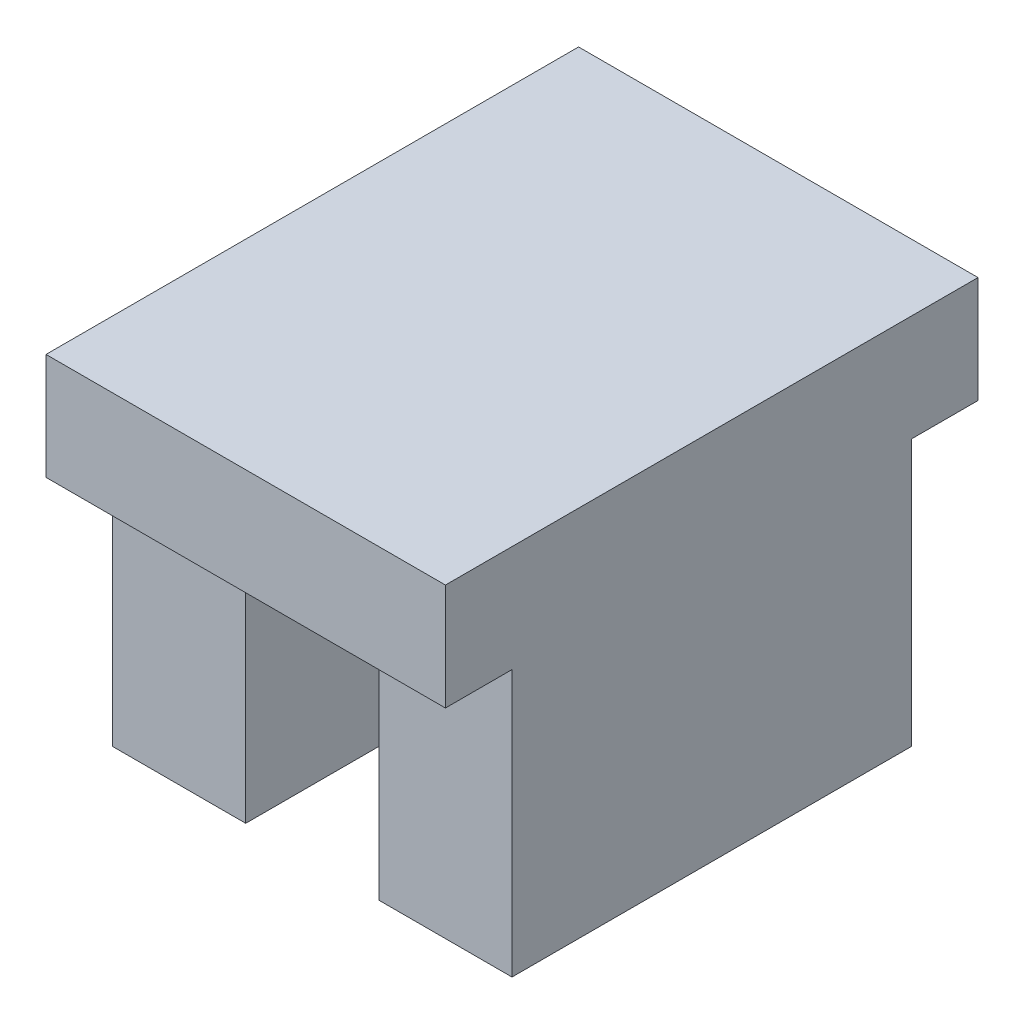
ISO-10303-21;
HEADER;
FILE_DESCRIPTION(('STEP AP214'),'2;1');
FILE_NAME('part.step','',(''),(''),'','','');
FILE_SCHEMA(('AUTOMOTIVE_DESIGN { 1 0 10303 214 1 1 1 1 }'));
ENDSEC;
DATA;
#1=APPLICATION_CONTEXT('core data for automotive mechanical design processes');
#2=APPLICATION_PROTOCOL_DEFINITION('international standard','automotive_design',2000,#1);
#3=PRODUCT_CONTEXT('',#1,'mechanical');
#4=PRODUCT('Part','Part','',(#3));
#5=PRODUCT_RELATED_PRODUCT_CATEGORY('part','',(#4));
#6=PRODUCT_DEFINITION_FORMATION('','',#4);
#7=PRODUCT_DEFINITION_CONTEXT('part definition',#1,'design');
#8=PRODUCT_DEFINITION('design','',#6,#7);
#9=PRODUCT_DEFINITION_SHAPE('','',#8);
#10=(LENGTH_UNIT() NAMED_UNIT(*) SI_UNIT(.MILLI.,.METRE.));
#11=(NAMED_UNIT(*) PLANE_ANGLE_UNIT() SI_UNIT($,.RADIAN.));
#12=(NAMED_UNIT(*) SI_UNIT($,.STERADIAN.) SOLID_ANGLE_UNIT());
#13=UNCERTAINTY_MEASURE_WITH_UNIT(LENGTH_MEASURE(1.E-05),#10,'distance_accuracy_value','');
#14=(GEOMETRIC_REPRESENTATION_CONTEXT(3) GLOBAL_UNCERTAINTY_ASSIGNED_CONTEXT((#13)) GLOBAL_UNIT_ASSIGNED_CONTEXT((#10,
#11,#12)) REPRESENTATION_CONTEXT('',''));
#15=CARTESIAN_POINT('',(0.,0.,0.));
#16=DIRECTION('',(0.,0.,1.));
#17=DIRECTION('',(1.,0.,0.));
#18=AXIS2_PLACEMENT_3D('',#15,#16,#17);
#19=CARTESIAN_POINT('',(0.,0.,-40.));
#20=DIRECTION('',(0.,-1.,0.));
#21=DIRECTION('',(0.,0.,-1.));
#22=AXIS2_PLACEMENT_3D('',#19,#20,#21);
#23=PLANE('',#22);
#24=DIRECTION('',(0.,0.,-1.));
#25=VECTOR('',#24,1.);
#26=CARTESIAN_POINT('',(20.,0.,-5.));
#27=LINE('',#26,#25);
#28=CARTESIAN_POINT('',(20.,0.,-5.));
#29=VERTEX_POINT('',#28);
#30=CARTESIAN_POINT('',(20.,0.,-35.));
#31=VERTEX_POINT('',#30);
#32=EDGE_CURVE('E142',#29,#31,#27,.T.);
#33=ORIENTED_EDGE('',*,*,#32,.F.);
#34=DIRECTION('',(-1.,0.,0.));
#35=VECTOR('',#34,1.);
#36=CARTESIAN_POINT('',(30.,0.,-5.));
#37=LINE('',#36,#35);
#38=CARTESIAN_POINT('',(30.,0.,-5.));
#39=VERTEX_POINT('',#38);
#40=EDGE_CURVE('E128',#39,#29,#37,.T.);
#41=ORIENTED_EDGE('',*,*,#40,.F.);
#42=DIRECTION('',(0.,0.,-1.));
#43=VECTOR('',#42,1.);
#44=CARTESIAN_POINT('',(30.,0.,0.));
#45=LINE('',#44,#43);
#46=CARTESIAN_POINT('',(30.,0.,0.));
#47=VERTEX_POINT('',#46);
#48=EDGE_CURVE('E140',#47,#39,#45,.T.);
#49=ORIENTED_EDGE('',*,*,#48,.F.);
#50=DIRECTION('',(1.,0.,0.));
#51=VECTOR('',#50,1.);
#52=CARTESIAN_POINT('',(0.,0.,0.));
#53=LINE('',#52,#51);
#54=CARTESIAN_POINT('',(0.,0.,0.));
#55=VERTEX_POINT('',#54);
#56=EDGE_CURVE('E153',#55,#47,#53,.T.);
#57=ORIENTED_EDGE('',*,*,#56,.F.);
#58=DIRECTION('',(0.,0.,1.));
#59=VECTOR('',#58,1.);
#60=CARTESIAN_POINT('',(0.,0.,0.));
#61=LINE('',#60,#59);
#62=CARTESIAN_POINT('',(0.,0.,-5.));
#63=VERTEX_POINT('',#62);
#64=EDGE_CURVE('E175',#63,#55,#61,.T.);
#65=ORIENTED_EDGE('',*,*,#64,.F.);
#66=DIRECTION('',(-1.,0.,0.));
#67=VECTOR('',#66,1.);
#68=CARTESIAN_POINT('',(10.,0.,-5.));
#69=LINE('',#68,#67);
#70=CARTESIAN_POINT('',(10.,0.,-5.));
#71=VERTEX_POINT('',#70);
#72=EDGE_CURVE('E200',#71,#63,#69,.T.);
#73=ORIENTED_EDGE('',*,*,#72,.F.);
#74=DIRECTION('',(0.,0.,1.));
#75=VECTOR('',#74,1.);
#76=CARTESIAN_POINT('',(10.,0.,-5.));
#77=LINE('',#76,#75);
#78=CARTESIAN_POINT('',(10.,0.,-35.));
#79=VERTEX_POINT('',#78);
#80=EDGE_CURVE('E58',#79,#71,#77,.T.);
#81=ORIENTED_EDGE('',*,*,#80,.F.);
#82=DIRECTION('',(1.,0.,0.));
#83=VECTOR('',#82,1.);
#84=CARTESIAN_POINT('',(10.,0.,-35.));
#85=LINE('',#84,#83);
#86=CARTESIAN_POINT('',(0.,0.,-35.));
#87=VERTEX_POINT('',#86);
#88=EDGE_CURVE('E197',#87,#79,#85,.T.);
#89=ORIENTED_EDGE('',*,*,#88,.F.);
#90=CARTESIAN_POINT('',(0.,0.,-40.));
#91=VERTEX_POINT('',#90);
#92=EDGE_CURVE('E172',#91,#87,#61,.T.);
#93=ORIENTED_EDGE('',*,*,#92,.F.);
#94=DIRECTION('',(-1.,0.,0.));
#95=VECTOR('',#94,1.);
#96=CARTESIAN_POINT('',(0.,0.,-40.));
#97=LINE('',#96,#95);
#98=CARTESIAN_POINT('',(30.,0.,-40.));
#99=VERTEX_POINT('',#98);
#100=EDGE_CURVE('E148',#99,#91,#97,.T.);
#101=ORIENTED_EDGE('',*,*,#100,.F.);
#102=CARTESIAN_POINT('',(30.,0.,-35.));
#103=VERTEX_POINT('',#102);
#104=EDGE_CURVE('E149',#103,#99,#45,.T.);
#105=ORIENTED_EDGE('',*,*,#104,.F.);
#106=DIRECTION('',(1.,0.,0.));
#107=VECTOR('',#106,1.);
#108=CARTESIAN_POINT('',(30.,0.,-35.));
#109=LINE('',#108,#107);
#110=EDGE_CURVE('E244',#31,#103,#109,.T.);
#111=ORIENTED_EDGE('',*,*,#110,.F.);
#112=EDGE_LOOP('',(#33,#41,#49,#57,#65,#73,#81,#89,#93,#101,#105,#111));
#113=FACE_BOUND('',#112,.T.);
#114=ADVANCED_FACE('F33',(#113),#23,.T.);
#115=CARTESIAN_POINT('',(0.,8.,0.));
#116=DIRECTION('',(1.,0.,0.));
#117=DIRECTION('',(0.,0.,-1.));
#118=AXIS2_PLACEMENT_3D('',#115,#116,#117);
#119=PLANE('',#118);
#120=ORIENTED_EDGE('',*,*,#92,.T.);
#121=DIRECTION('',(0.,1.,0.));
#122=VECTOR('',#121,1.);
#123=CARTESIAN_POINT('',(0.,-20.,-35.));
#124=LINE('',#123,#122);
#125=CARTESIAN_POINT('',(0.,-20.,-35.));
#126=VERTEX_POINT('',#125);
#127=EDGE_CURVE('E187',#126,#87,#124,.T.);
#128=ORIENTED_EDGE('',*,*,#127,.F.);
#129=DIRECTION('',(0.,0.,-1.));
#130=VECTOR('',#129,1.);
#131=CARTESIAN_POINT('',(0.,-20.,-5.));
#132=LINE('',#131,#130);
#133=CARTESIAN_POINT('',(0.,-20.,-5.));
#134=VERTEX_POINT('',#133);
#135=EDGE_CURVE('E190',#134,#126,#132,.T.);
#136=ORIENTED_EDGE('',*,*,#135,.F.);
#137=DIRECTION('',(0.,1.,0.));
#138=VECTOR('',#137,1.);
#139=CARTESIAN_POINT('',(0.,-20.,-5.));
#140=LINE('',#139,#138);
#141=EDGE_CURVE('E183',#134,#63,#140,.T.);
#142=ORIENTED_EDGE('',*,*,#141,.T.);
#143=ORIENTED_EDGE('',*,*,#64,.T.);
#144=DIRECTION('',(0.,-1.,0.));
#145=VECTOR('',#144,1.);
#146=CARTESIAN_POINT('',(0.,8.,0.));
#147=LINE('',#146,#145);
#148=CARTESIAN_POINT('',(0.,8.,0.));
#149=VERTEX_POINT('',#148);
#150=EDGE_CURVE('E11',#149,#55,#147,.T.);
#151=ORIENTED_EDGE('',*,*,#150,.F.);
#152=DIRECTION('',(0.,0.,1.));
#153=VECTOR('',#152,1.);
#154=CARTESIAN_POINT('',(0.,8.,0.));
#155=LINE('',#154,#153);
#156=CARTESIAN_POINT('',(0.,8.,-40.));
#157=VERTEX_POINT('',#156);
#158=EDGE_CURVE('E151',#157,#149,#155,.T.);
#159=ORIENTED_EDGE('',*,*,#158,.F.);
#160=DIRECTION('',(0.,-1.,0.));
#161=VECTOR('',#160,1.);
#162=CARTESIAN_POINT('',(0.,8.,-40.));
#163=LINE('',#162,#161);
#164=EDGE_CURVE('E165',#157,#91,#163,.T.);
#165=ORIENTED_EDGE('',*,*,#164,.T.);
#166=EDGE_LOOP('',(#120,#128,#136,#142,#143,#151,#159,#165));
#167=FACE_BOUND('',#166,.T.);
#168=ADVANCED_FACE('F35',(#167),#119,.F.);
#169=CARTESIAN_POINT('',(0.,8.,0.));
#170=DIRECTION('',(0.,0.,-1.));
#171=DIRECTION('',(-1.,0.,0.));
#172=AXIS2_PLACEMENT_3D('',#169,#170,#171);
#173=PLANE('',#172);
#174=ORIENTED_EDGE('',*,*,#56,.T.);
#175=DIRECTION('',(0.,-1.,0.));
#176=VECTOR('',#175,1.);
#177=CARTESIAN_POINT('',(30.,8.,0.));
#178=LINE('',#177,#176);
#179=CARTESIAN_POINT('',(30.,8.,0.));
#180=VERTEX_POINT('',#179);
#181=EDGE_CURVE('E42',#180,#47,#178,.T.);
#182=ORIENTED_EDGE('',*,*,#181,.F.);
#183=DIRECTION('',(1.,0.,0.));
#184=VECTOR('',#183,1.);
#185=CARTESIAN_POINT('',(0.,8.,0.));
#186=LINE('',#185,#184);
#187=EDGE_CURVE('E159',#149,#180,#186,.T.);
#188=ORIENTED_EDGE('',*,*,#187,.F.);
#189=ORIENTED_EDGE('',*,*,#150,.T.);
#190=EDGE_LOOP('',(#174,#182,#188,#189));
#191=FACE_BOUND('',#190,.T.);
#192=ADVANCED_FACE('F261',(#191),#173,.F.);
#193=CARTESIAN_POINT('',(30.,8.,0.));
#194=DIRECTION('',(-1.,0.,0.));
#195=DIRECTION('',(0.,0.,1.));
#196=AXIS2_PLACEMENT_3D('',#193,#194,#195);
#197=PLANE('',#196);
#198=ORIENTED_EDGE('',*,*,#48,.T.);
#199=DIRECTION('',(0.,1.,0.));
#200=VECTOR('',#199,1.);
#201=CARTESIAN_POINT('',(30.,-20.,-5.));
#202=LINE('',#201,#200);
#203=CARTESIAN_POINT('',(30.,-20.,-5.));
#204=VERTEX_POINT('',#203);
#205=EDGE_CURVE('E124',#204,#39,#202,.T.);
#206=ORIENTED_EDGE('',*,*,#205,.F.);
#207=DIRECTION('',(0.,0.,1.));
#208=VECTOR('',#207,1.);
#209=CARTESIAN_POINT('',(30.,-20.,-5.));
#210=LINE('',#209,#208);
#211=CARTESIAN_POINT('',(30.,-20.,-35.));
#212=VERTEX_POINT('',#211);
#213=EDGE_CURVE('E229',#212,#204,#210,.T.);
#214=ORIENTED_EDGE('',*,*,#213,.F.);
#215=DIRECTION('',(0.,1.,0.));
#216=VECTOR('',#215,1.);
#217=CARTESIAN_POINT('',(30.,-20.,-35.));
#218=LINE('',#217,#216);
#219=EDGE_CURVE('E228',#212,#103,#218,.T.);
#220=ORIENTED_EDGE('',*,*,#219,.T.);
#221=ORIENTED_EDGE('',*,*,#104,.T.);
#222=DIRECTION('',(0.,-1.,0.));
#223=VECTOR('',#222,1.);
#224=CARTESIAN_POINT('',(30.,8.,-40.));
#225=LINE('',#224,#223);
#226=CARTESIAN_POINT('',(30.,8.,-40.));
#227=VERTEX_POINT('',#226);
#228=EDGE_CURVE('E168',#227,#99,#225,.T.);
#229=ORIENTED_EDGE('',*,*,#228,.F.);
#230=DIRECTION('',(0.,0.,-1.));
#231=VECTOR('',#230,1.);
#232=CARTESIAN_POINT('',(30.,8.,0.));
#233=LINE('',#232,#231);
#234=EDGE_CURVE('E161',#180,#227,#233,.T.);
#235=ORIENTED_EDGE('',*,*,#234,.F.);
#236=ORIENTED_EDGE('',*,*,#181,.T.);
#237=EDGE_LOOP('',(#198,#206,#214,#220,#221,#229,#235,#236));
#238=FACE_BOUND('',#237,.T.);
#239=ADVANCED_FACE('F145',(#238),#197,.F.);
#240=CARTESIAN_POINT('',(0.,8.,-40.));
#241=DIRECTION('',(0.,0.,1.));
#242=DIRECTION('',(1.,0.,0.));
#243=AXIS2_PLACEMENT_3D('',#240,#241,#242);
#244=PLANE('',#243);
#245=ORIENTED_EDGE('',*,*,#100,.T.);
#246=ORIENTED_EDGE('',*,*,#164,.F.);
#247=DIRECTION('',(-1.,0.,0.));
#248=VECTOR('',#247,1.);
#249=CARTESIAN_POINT('',(0.,8.,-40.));
#250=LINE('',#249,#248);
#251=EDGE_CURVE('E163',#227,#157,#250,.T.);
#252=ORIENTED_EDGE('',*,*,#251,.F.);
#253=ORIENTED_EDGE('',*,*,#228,.T.);
#254=EDGE_LOOP('',(#245,#246,#252,#253));
#255=FACE_BOUND('',#254,.T.);
#256=ADVANCED_FACE('F223',(#255),#244,.F.);
#257=CARTESIAN_POINT('',(0.,8.,-40.));
#258=DIRECTION('',(0.,-1.,0.));
#259=DIRECTION('',(0.,0.,-1.));
#260=AXIS2_PLACEMENT_3D('',#257,#258,#259);
#261=PLANE('',#260);
#262=ORIENTED_EDGE('',*,*,#158,.T.);
#263=ORIENTED_EDGE('',*,*,#187,.T.);
#264=ORIENTED_EDGE('',*,*,#234,.T.);
#265=ORIENTED_EDGE('',*,*,#251,.T.);
#266=EDGE_LOOP('',(#262,#263,#264,#265));
#267=FACE_BOUND('',#266,.T.);
#268=ADVANCED_FACE('F266',(#267),#261,.F.);
#269=CARTESIAN_POINT('',(10.,-20.,-5.));
#270=DIRECTION('',(-1.,0.,0.));
#271=DIRECTION('',(0.,0.,1.));
#272=AXIS2_PLACEMENT_3D('',#269,#270,#271);
#273=PLANE('',#272);
#274=ORIENTED_EDGE('',*,*,#80,.T.);
#275=DIRECTION('',(0.,1.,0.));
#276=VECTOR('',#275,1.);
#277=CARTESIAN_POINT('',(10.,-20.,-5.));
#278=LINE('',#277,#276);
#279=CARTESIAN_POINT('',(10.,-20.,-5.));
#280=VERTEX_POINT('',#279);
#281=EDGE_CURVE('E179',#280,#71,#278,.T.);
#282=ORIENTED_EDGE('',*,*,#281,.F.);
#283=DIRECTION('',(0.,0.,1.));
#284=VECTOR('',#283,1.);
#285=CARTESIAN_POINT('',(10.,-20.,-5.));
#286=LINE('',#285,#284);
#287=CARTESIAN_POINT('',(10.,-20.,-35.));
#288=VERTEX_POINT('',#287);
#289=EDGE_CURVE('E194',#288,#280,#286,.T.);
#290=ORIENTED_EDGE('',*,*,#289,.F.);
#291=DIRECTION('',(0.,1.,0.));
#292=VECTOR('',#291,1.);
#293=CARTESIAN_POINT('',(10.,-20.,-35.));
#294=LINE('',#293,#292);
#295=EDGE_CURVE('E184',#288,#79,#294,.T.);
#296=ORIENTED_EDGE('',*,*,#295,.T.);
#297=EDGE_LOOP('',(#274,#282,#290,#296));
#298=FACE_BOUND('',#297,.T.);
#299=ADVANCED_FACE('F264',(#298),#273,.F.);
#300=CARTESIAN_POINT('',(10.,-20.,-5.));
#301=DIRECTION('',(0.,0.,-1.));
#302=DIRECTION('',(-1.,0.,0.));
#303=AXIS2_PLACEMENT_3D('',#300,#301,#302);
#304=PLANE('',#303);
#305=ORIENTED_EDGE('',*,*,#72,.T.);
#306=ORIENTED_EDGE('',*,*,#141,.F.);
#307=DIRECTION('',(-1.,0.,0.));
#308=VECTOR('',#307,1.);
#309=CARTESIAN_POINT('',(10.,-20.,-5.));
#310=LINE('',#309,#308);
#311=EDGE_CURVE('E192',#280,#134,#310,.T.);
#312=ORIENTED_EDGE('',*,*,#311,.F.);
#313=ORIENTED_EDGE('',*,*,#281,.T.);
#314=EDGE_LOOP('',(#305,#306,#312,#313));
#315=FACE_BOUND('',#314,.T.);
#316=ADVANCED_FACE('F280',(#315),#304,.F.);
#317=CARTESIAN_POINT('',(10.,-20.,-35.));
#318=DIRECTION('',(0.,0.,1.));
#319=DIRECTION('',(1.,0.,0.));
#320=AXIS2_PLACEMENT_3D('',#317,#318,#319);
#321=PLANE('',#320);
#322=ORIENTED_EDGE('',*,*,#88,.T.);
#323=ORIENTED_EDGE('',*,*,#295,.F.);
#324=DIRECTION('',(1.,0.,0.));
#325=VECTOR('',#324,1.);
#326=CARTESIAN_POINT('',(10.,-20.,-35.));
#327=LINE('',#326,#325);
#328=EDGE_CURVE('E188',#126,#288,#327,.T.);
#329=ORIENTED_EDGE('',*,*,#328,.F.);
#330=ORIENTED_EDGE('',*,*,#127,.T.);
#331=EDGE_LOOP('',(#322,#323,#329,#330));
#332=FACE_BOUND('',#331,.T.);
#333=ADVANCED_FACE('F213',(#332),#321,.F.);
#334=CARTESIAN_POINT('',(10.,-20.,-5.));
#335=DIRECTION('',(0.,1.,0.));
#336=DIRECTION('',(0.,0.,1.));
#337=AXIS2_PLACEMENT_3D('',#334,#335,#336);
#338=PLANE('',#337);
#339=ORIENTED_EDGE('',*,*,#289,.T.);
#340=ORIENTED_EDGE('',*,*,#311,.T.);
#341=ORIENTED_EDGE('',*,*,#135,.T.);
#342=ORIENTED_EDGE('',*,*,#328,.T.);
#343=EDGE_LOOP('',(#339,#340,#341,#342));
#344=FACE_BOUND('',#343,.T.);
#345=ADVANCED_FACE('F285',(#344),#338,.F.);
#346=CARTESIAN_POINT('',(30.,-20.,-5.));
#347=DIRECTION('',(0.,0.,-1.));
#348=DIRECTION('',(-1.,0.,0.));
#349=AXIS2_PLACEMENT_3D('',#346,#347,#348);
#350=PLANE('',#349);
#351=ORIENTED_EDGE('',*,*,#40,.T.);
#352=DIRECTION('',(0.,1.,0.));
#353=VECTOR('',#352,1.);
#354=CARTESIAN_POINT('',(20.,-20.,-5.));
#355=LINE('',#354,#353);
#356=CARTESIAN_POINT('',(20.,-20.,-5.));
#357=VERTEX_POINT('',#356);
#358=EDGE_CURVE('E135',#357,#29,#355,.T.);
#359=ORIENTED_EDGE('',*,*,#358,.F.);
#360=DIRECTION('',(-1.,0.,0.));
#361=VECTOR('',#360,1.);
#362=CARTESIAN_POINT('',(30.,-20.,-5.));
#363=LINE('',#362,#361);
#364=EDGE_CURVE('E130',#204,#357,#363,.T.);
#365=ORIENTED_EDGE('',*,*,#364,.F.);
#366=ORIENTED_EDGE('',*,*,#205,.T.);
#367=EDGE_LOOP('',(#351,#359,#365,#366));
#368=FACE_BOUND('',#367,.T.);
#369=ADVANCED_FACE('F126',(#368),#350,.F.);
#370=CARTESIAN_POINT('',(20.,-20.,-5.));
#371=DIRECTION('',(1.,0.,0.));
#372=DIRECTION('',(0.,0.,-1.));
#373=AXIS2_PLACEMENT_3D('',#370,#371,#372);
#374=PLANE('',#373);
#375=ORIENTED_EDGE('',*,*,#32,.T.);
#376=DIRECTION('',(0.,1.,0.));
#377=VECTOR('',#376,1.);
#378=CARTESIAN_POINT('',(20.,-20.,-35.));
#379=LINE('',#378,#377);
#380=CARTESIAN_POINT('',(20.,-20.,-35.));
#381=VERTEX_POINT('',#380);
#382=EDGE_CURVE('E50',#381,#31,#379,.T.);
#383=ORIENTED_EDGE('',*,*,#382,.F.);
#384=DIRECTION('',(0.,0.,-1.));
#385=VECTOR('',#384,1.);
#386=CARTESIAN_POINT('',(20.,-20.,-5.));
#387=LINE('',#386,#385);
#388=EDGE_CURVE('E233',#357,#381,#387,.T.);
#389=ORIENTED_EDGE('',*,*,#388,.F.);
#390=ORIENTED_EDGE('',*,*,#358,.T.);
#391=EDGE_LOOP('',(#375,#383,#389,#390));
#392=FACE_BOUND('',#391,.T.);
#393=ADVANCED_FACE('F239',(#392),#374,.F.);
#394=CARTESIAN_POINT('',(30.,-20.,-35.));
#395=DIRECTION('',(0.,0.,1.));
#396=DIRECTION('',(1.,0.,0.));
#397=AXIS2_PLACEMENT_3D('',#394,#395,#396);
#398=PLANE('',#397);
#399=ORIENTED_EDGE('',*,*,#110,.T.);
#400=ORIENTED_EDGE('',*,*,#219,.F.);
#401=DIRECTION('',(1.,0.,0.));
#402=VECTOR('',#401,1.);
#403=CARTESIAN_POINT('',(30.,-20.,-35.));
#404=LINE('',#403,#402);
#405=EDGE_CURVE('E230',#381,#212,#404,.T.);
#406=ORIENTED_EDGE('',*,*,#405,.F.);
#407=ORIENTED_EDGE('',*,*,#382,.T.);
#408=EDGE_LOOP('',(#399,#400,#406,#407));
#409=FACE_BOUND('',#408,.T.);
#410=ADVANCED_FACE('F246',(#409),#398,.F.);
#411=CARTESIAN_POINT('',(30.,-20.,-5.));
#412=DIRECTION('',(0.,1.,0.));
#413=DIRECTION('',(0.,0.,1.));
#414=AXIS2_PLACEMENT_3D('',#411,#412,#413);
#415=PLANE('',#414);
#416=ORIENTED_EDGE('',*,*,#213,.T.);
#417=ORIENTED_EDGE('',*,*,#364,.T.);
#418=ORIENTED_EDGE('',*,*,#388,.T.);
#419=ORIENTED_EDGE('',*,*,#405,.T.);
#420=EDGE_LOOP('',(#416,#417,#418,#419));
#421=FACE_BOUND('',#420,.T.);
#422=ADVANCED_FACE('F248',(#421),#415,.F.);
#423=CLOSED_SHELL('',(#114,#168,#192,#239,#256,#268,#299,#316,#333,#345,#369,#393,#410,#422));
#424=MANIFOLD_SOLID_BREP('B2',#423);
#425=ADVANCED_BREP_SHAPE_REPRESENTATION('',(#18,#424),#14);
#426=SHAPE_DEFINITION_REPRESENTATION(#9,#425);
ENDSEC;
END-ISO-10303-21;
